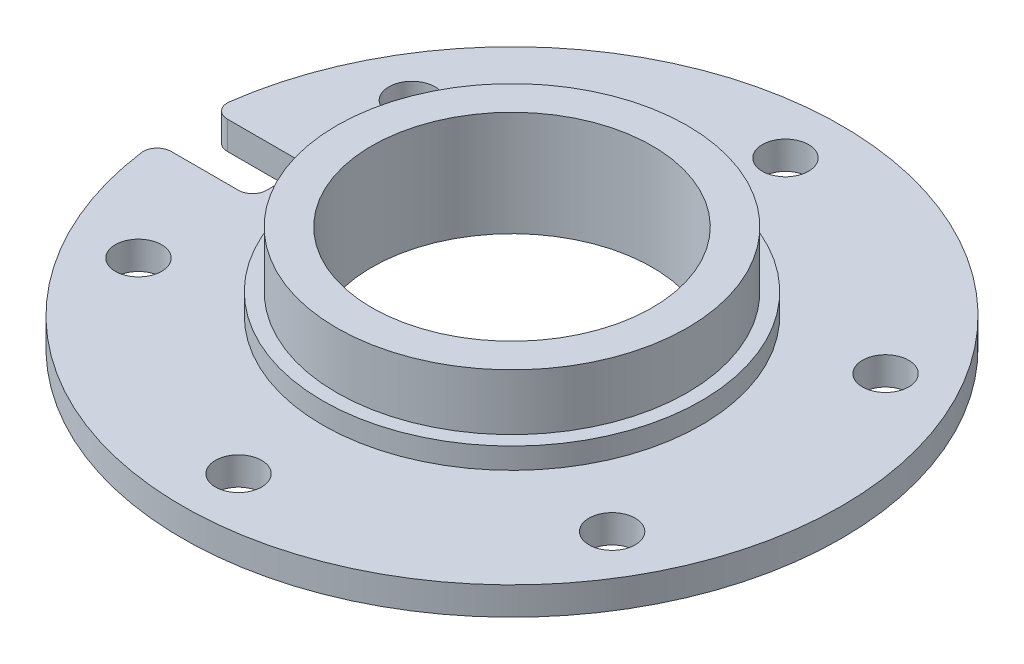
ISO-10303-21;
HEADER;
FILE_DESCRIPTION(('STEP AP214'),'2;1');
FILE_NAME('part.step','',(''),(''),'','','');
FILE_SCHEMA(('AUTOMOTIVE_DESIGN { 1 0 10303 214 1 1 1 1 }'));
ENDSEC;
DATA;
#1=APPLICATION_CONTEXT('core data for automotive mechanical design processes');
#2=APPLICATION_PROTOCOL_DEFINITION('international standard','automotive_design',2000,#1);
#3=PRODUCT_CONTEXT('',#1,'mechanical');
#4=PRODUCT('Part','Part','',(#3));
#5=PRODUCT_RELATED_PRODUCT_CATEGORY('part','',(#4));
#6=PRODUCT_DEFINITION_FORMATION('','',#4);
#7=PRODUCT_DEFINITION_CONTEXT('part definition',#1,'design');
#8=PRODUCT_DEFINITION('design','',#6,#7);
#9=PRODUCT_DEFINITION_SHAPE('','',#8);
#10=(LENGTH_UNIT() NAMED_UNIT(*) SI_UNIT(.MILLI.,.METRE.));
#11=(NAMED_UNIT(*) PLANE_ANGLE_UNIT() SI_UNIT($,.RADIAN.));
#12=(NAMED_UNIT(*) SI_UNIT($,.STERADIAN.) SOLID_ANGLE_UNIT());
#13=UNCERTAINTY_MEASURE_WITH_UNIT(LENGTH_MEASURE(1.E-05),#10,'distance_accuracy_value','');
#14=(GEOMETRIC_REPRESENTATION_CONTEXT(3) GLOBAL_UNCERTAINTY_ASSIGNED_CONTEXT((#13)) GLOBAL_UNIT_ASSIGNED_CONTEXT((#10,
#11,#12)) REPRESENTATION_CONTEXT('',''));
#15=CARTESIAN_POINT('',(0.,0.,0.));
#16=DIRECTION('',(0.,0.,1.));
#17=DIRECTION('',(1.,0.,0.));
#18=AXIS2_PLACEMENT_3D('',#15,#16,#17);
#19=CARTESIAN_POINT('',(0.,0.,0.));
#20=DIRECTION('',(0.,1.,0.));
#21=DIRECTION('',(0.,0.,1.));
#22=AXIS2_PLACEMENT_3D('',#19,#20,#21);
#23=PLANE('',#22);
#24=CARTESIAN_POINT('',(0.,0.,-19.5));
#25=DIRECTION('',(0.,-1.,0.));
#26=DIRECTION('',(0.,0.,-1.));
#27=AXIS2_PLACEMENT_3D('',#24,#25,#26);
#28=CIRCLE('',#27,1.65);
#29=CARTESIAN_POINT('',(0.,0.,-21.15));
#30=VERTEX_POINT('',#29);
#31=EDGE_CURVE('E312',#30,#30,#28,.T.);
#32=ORIENTED_EDGE('',*,*,#31,.F.);
#33=EDGE_LOOP('',(#32));
#34=FACE_BOUND('',#33,.T.);
#35=CARTESIAN_POINT('',(16.8874953737966,0.,-9.75));
#36=DIRECTION('',(0.,-1.,0.));
#37=DIRECTION('',(0.,0.,-1.));
#38=AXIS2_PLACEMENT_3D('',#35,#36,#37);
#39=CIRCLE('',#38,1.65);
#40=CARTESIAN_POINT('',(16.8874953737966,0.,-11.4));
#41=VERTEX_POINT('',#40);
#42=EDGE_CURVE('E181',#41,#41,#39,.T.);
#43=ORIENTED_EDGE('',*,*,#42,.F.);
#44=EDGE_LOOP('',(#43));
#45=FACE_BOUND('',#44,.T.);
#46=CARTESIAN_POINT('',(16.8874953737966,0.,9.75));
#47=DIRECTION('',(0.,-1.,0.));
#48=DIRECTION('',(0.,0.,-1.));
#49=AXIS2_PLACEMENT_3D('',#46,#47,#48);
#50=CIRCLE('',#49,1.65);
#51=CARTESIAN_POINT('',(16.8874953737966,0.,8.1));
#52=VERTEX_POINT('',#51);
#53=EDGE_CURVE('E171',#52,#52,#50,.T.);
#54=ORIENTED_EDGE('',*,*,#53,.F.);
#55=EDGE_LOOP('',(#54));
#56=FACE_BOUND('',#55,.T.);
#57=CARTESIAN_POINT('',(0.,0.,19.5));
#58=DIRECTION('',(0.,-1.,0.));
#59=DIRECTION('',(0.,0.,-1.));
#60=AXIS2_PLACEMENT_3D('',#57,#58,#59);
#61=CIRCLE('',#60,1.65);
#62=CARTESIAN_POINT('',(0.,0.,17.85));
#63=VERTEX_POINT('',#62);
#64=EDGE_CURVE('E168',#63,#63,#61,.T.);
#65=ORIENTED_EDGE('',*,*,#64,.F.);
#66=EDGE_LOOP('',(#65));
#67=FACE_BOUND('',#66,.T.);
#68=CARTESIAN_POINT('',(-16.8874953737966,0.,9.75000000000001));
#69=DIRECTION('',(0.,-1.,0.));
#70=DIRECTION('',(0.,0.,-1.));
#71=AXIS2_PLACEMENT_3D('',#68,#69,#70);
#72=CIRCLE('',#71,1.65);
#73=CARTESIAN_POINT('',(-16.8874953737966,0.,8.10000000000001));
#74=VERTEX_POINT('',#73);
#75=EDGE_CURVE('E165',#74,#74,#72,.T.);
#76=ORIENTED_EDGE('',*,*,#75,.F.);
#77=EDGE_LOOP('',(#76));
#78=FACE_BOUND('',#77,.T.);
#79=CARTESIAN_POINT('',(0.,0.,0.));
#80=DIRECTION('',(0.,1.,0.));
#81=DIRECTION('',(0.,0.,1.));
#82=AXIS2_PLACEMENT_3D('',#79,#80,#81);
#83=CIRCLE('',#82,10.);
#84=CARTESIAN_POINT('',(0.,0.,10.));
#85=VERTEX_POINT('',#84);
#86=EDGE_CURVE('E221',#85,#85,#83,.T.);
#87=ORIENTED_EDGE('',*,*,#86,.T.);
#88=EDGE_LOOP('',(#87));
#89=FACE_BOUND('',#88,.T.);
#90=CARTESIAN_POINT('',(0.,0.,0.));
#91=DIRECTION('',(0.,1.,0.));
#92=DIRECTION('',(0.,0.,1.));
#93=AXIS2_PLACEMENT_3D('',#90,#91,#92);
#94=CIRCLE('',#93,23.5);
#95=CARTESIAN_POINT('',(-23.290174370799,0.,3.13333333333333));
#96=VERTEX_POINT('',#95);
#97=CARTESIAN_POINT('',(-23.290174370799,0.,-3.13333333333334));
#98=VERTEX_POINT('',#97);
#99=EDGE_CURVE('E132',#96,#98,#94,.T.);
#100=ORIENTED_EDGE('',*,*,#99,.F.);
#101=CARTESIAN_POINT('',(-22.2991031209778,0.,3.));
#102=DIRECTION('',(0.,1.,0.));
#103=DIRECTION('',(0.,0.,1.));
#104=AXIS2_PLACEMENT_3D('',#101,#102,#103);
#105=CIRCLE('',#104,1.);
#106=CARTESIAN_POINT('',(-22.2991031209778,0.,2.));
#107=VERTEX_POINT('',#106);
#108=EDGE_CURVE('E135',#96,#107,#105,.F.);
#109=ORIENTED_EDGE('',*,*,#108,.T.);
#110=DIRECTION('',(-1.,0.,0.));
#111=VECTOR('',#110,1.);
#112=CARTESIAN_POINT('',(-24.2569867476914,0.,2.));
#113=LINE('',#112,#111);
#114=CARTESIAN_POINT('',(-17.5,0.,2.));
#115=VERTEX_POINT('',#114);
#116=EDGE_CURVE('E197',#115,#107,#113,.T.);
#117=ORIENTED_EDGE('',*,*,#116,.F.);
#118=CARTESIAN_POINT('',(-17.5,0.,0.999999999999997));
#119=DIRECTION('',(0.,1.,0.));
#120=DIRECTION('',(0.,0.,1.));
#121=AXIS2_PLACEMENT_3D('',#118,#119,#120);
#122=CIRCLE('',#121,1.);
#123=CARTESIAN_POINT('',(-16.5,0.,0.999999999999997));
#124=VERTEX_POINT('',#123);
#125=EDGE_CURVE('E156',#115,#124,#122,.T.);
#126=ORIENTED_EDGE('',*,*,#125,.T.);
#127=DIRECTION('',(0.,0.,1.));
#128=VECTOR('',#127,1.);
#129=CARTESIAN_POINT('',(-16.5,0.,2.));
#130=LINE('',#129,#128);
#131=CARTESIAN_POINT('',(-16.5,0.,-1.));
#132=VERTEX_POINT('',#131);
#133=EDGE_CURVE('E195',#132,#124,#130,.T.);
#134=ORIENTED_EDGE('',*,*,#133,.F.);
#135=CARTESIAN_POINT('',(-17.5,0.,-1.));
#136=DIRECTION('',(0.,1.,0.));
#137=DIRECTION('',(0.,0.,1.));
#138=AXIS2_PLACEMENT_3D('',#135,#136,#137);
#139=CIRCLE('',#138,1.);
#140=CARTESIAN_POINT('',(-17.5,0.,-2.));
#141=VERTEX_POINT('',#140);
#142=EDGE_CURVE('E52',#132,#141,#139,.T.);
#143=ORIENTED_EDGE('',*,*,#142,.T.);
#144=DIRECTION('',(1.,0.,0.));
#145=VECTOR('',#144,1.);
#146=CARTESIAN_POINT('',(-24.2569867476914,0.,-2.));
#147=LINE('',#146,#145);
#148=CARTESIAN_POINT('',(-22.2991031209778,0.,-2.));
#149=VERTEX_POINT('',#148);
#150=EDGE_CURVE('E192',#149,#141,#147,.T.);
#151=ORIENTED_EDGE('',*,*,#150,.F.);
#152=CARTESIAN_POINT('',(-22.2991031209778,0.,-3.));
#153=DIRECTION('',(0.,1.,0.));
#154=DIRECTION('',(0.,0.,1.));
#155=AXIS2_PLACEMENT_3D('',#152,#153,#154);
#156=CIRCLE('',#155,1.);
#157=EDGE_CURVE('E136',#149,#98,#156,.F.);
#158=ORIENTED_EDGE('',*,*,#157,.T.);
#159=EDGE_LOOP('',(#100,#109,#117,#126,#134,#143,#151,#158));
#160=FACE_BOUND('',#159,.T.);
#161=CARTESIAN_POINT('',(-16.8874953737966,0.,-9.75));
#162=DIRECTION('',(0.,-1.,0.));
#163=DIRECTION('',(0.,0.,-1.));
#164=AXIS2_PLACEMENT_3D('',#161,#162,#163);
#165=CIRCLE('',#164,1.65);
#166=CARTESIAN_POINT('',(-16.8874953737966,0.,-11.4));
#167=VERTEX_POINT('',#166);
#168=EDGE_CURVE('E164',#167,#167,#165,.T.);
#169=ORIENTED_EDGE('',*,*,#168,.F.);
#170=EDGE_LOOP('',(#169));
#171=FACE_BOUND('',#170,.T.);
#172=ADVANCED_FACE('F43',(#34,#45,#56,#67,#78,#89,#160,#171),#23,.F.);
#173=CARTESIAN_POINT('',(0.,2.,0.));
#174=DIRECTION('',(0.,1.,0.));
#175=DIRECTION('',(0.,0.,1.));
#176=AXIS2_PLACEMENT_3D('',#173,#174,#175);
#177=PLANE('',#176);
#178=CARTESIAN_POINT('',(0.,2.,-19.5));
#179=DIRECTION('',(0.,1.,0.));
#180=DIRECTION('',(0.,0.,1.));
#181=AXIS2_PLACEMENT_3D('',#178,#179,#180);
#182=CIRCLE('',#181,1.65);
#183=CARTESIAN_POINT('',(0.,2.,-17.85));
#184=VERTEX_POINT('',#183);
#185=EDGE_CURVE('E310',#184,#184,#182,.T.);
#186=ORIENTED_EDGE('',*,*,#185,.F.);
#187=EDGE_LOOP('',(#186));
#188=FACE_BOUND('',#187,.T.);
#189=CARTESIAN_POINT('',(16.8874953737966,2.,-9.75));
#190=DIRECTION('',(0.,1.,0.));
#191=DIRECTION('',(0.,0.,1.));
#192=AXIS2_PLACEMENT_3D('',#189,#190,#191);
#193=CIRCLE('',#192,1.65);
#194=CARTESIAN_POINT('',(16.8874953737966,2.,-8.1));
#195=VERTEX_POINT('',#194);
#196=EDGE_CURVE('E47',#195,#195,#193,.T.);
#197=ORIENTED_EDGE('',*,*,#196,.F.);
#198=EDGE_LOOP('',(#197));
#199=FACE_BOUND('',#198,.T.);
#200=CARTESIAN_POINT('',(16.8874953737966,2.,9.75));
#201=DIRECTION('',(0.,1.,0.));
#202=DIRECTION('',(0.,0.,1.));
#203=AXIS2_PLACEMENT_3D('',#200,#201,#202);
#204=CIRCLE('',#203,1.65);
#205=CARTESIAN_POINT('',(16.8874953737966,2.,11.4));
#206=VERTEX_POINT('',#205);
#207=EDGE_CURVE('E169',#206,#206,#204,.T.);
#208=ORIENTED_EDGE('',*,*,#207,.F.);
#209=EDGE_LOOP('',(#208));
#210=FACE_BOUND('',#209,.T.);
#211=CARTESIAN_POINT('',(0.,2.,19.5));
#212=DIRECTION('',(0.,1.,0.));
#213=DIRECTION('',(0.,0.,1.));
#214=AXIS2_PLACEMENT_3D('',#211,#212,#213);
#215=CIRCLE('',#214,1.65);
#216=CARTESIAN_POINT('',(0.,2.,21.15));
#217=VERTEX_POINT('',#216);
#218=EDGE_CURVE('E166',#217,#217,#215,.T.);
#219=ORIENTED_EDGE('',*,*,#218,.F.);
#220=EDGE_LOOP('',(#219));
#221=FACE_BOUND('',#220,.T.);
#222=CARTESIAN_POINT('',(-16.8874953737966,2.,9.75000000000001));
#223=DIRECTION('',(0.,1.,0.));
#224=DIRECTION('',(0.,0.,1.));
#225=AXIS2_PLACEMENT_3D('',#222,#223,#224);
#226=CIRCLE('',#225,1.65);
#227=CARTESIAN_POINT('',(-16.8874953737966,2.,11.4));
#228=VERTEX_POINT('',#227);
#229=EDGE_CURVE('E161',#228,#228,#226,.T.);
#230=ORIENTED_EDGE('',*,*,#229,.F.);
#231=EDGE_LOOP('',(#230));
#232=FACE_BOUND('',#231,.T.);
#233=CARTESIAN_POINT('',(-16.8874953737966,2.,-9.75));
#234=DIRECTION('',(0.,1.,0.));
#235=DIRECTION('',(0.,0.,1.));
#236=AXIS2_PLACEMENT_3D('',#233,#234,#235);
#237=CIRCLE('',#236,1.65);
#238=CARTESIAN_POINT('',(-16.8874953737966,2.,-8.1));
#239=VERTEX_POINT('',#238);
#240=EDGE_CURVE('E189',#239,#239,#237,.T.);
#241=ORIENTED_EDGE('',*,*,#240,.F.);
#242=EDGE_LOOP('',(#241));
#243=FACE_BOUND('',#242,.T.);
#244=DIRECTION('',(1.,0.,0.));
#245=VECTOR('',#244,1.);
#246=CARTESIAN_POINT('',(0.,2.,2.));
#247=LINE('',#246,#245);
#248=CARTESIAN_POINT('',(-22.2991031209778,2.,2.));
#249=VERTEX_POINT('',#248);
#250=CARTESIAN_POINT('',(-17.5,2.,2.));
#251=VERTEX_POINT('',#250);
#252=EDGE_CURVE('E116',#249,#251,#247,.T.);
#253=ORIENTED_EDGE('',*,*,#252,.F.);
#254=CARTESIAN_POINT('',(-22.2991031209778,2.,3.));
#255=DIRECTION('',(0.,1.,0.));
#256=DIRECTION('',(0.,0.,1.));
#257=AXIS2_PLACEMENT_3D('',#254,#255,#256);
#258=CIRCLE('',#257,1.);
#259=CARTESIAN_POINT('',(-23.290174370799,2.,3.13333333333333));
#260=VERTEX_POINT('',#259);
#261=EDGE_CURVE('E110',#249,#260,#258,.T.);
#262=ORIENTED_EDGE('',*,*,#261,.T.);
#263=CARTESIAN_POINT('',(0.,2.,0.));
#264=DIRECTION('',(0.,1.,0.));
#265=DIRECTION('',(0.,0.,1.));
#266=AXIS2_PLACEMENT_3D('',#263,#264,#265);
#267=CIRCLE('',#266,23.5);
#268=CARTESIAN_POINT('',(-23.290174370799,2.,-3.13333333333334));
#269=VERTEX_POINT('',#268);
#270=EDGE_CURVE('E114',#260,#269,#267,.T.);
#271=ORIENTED_EDGE('',*,*,#270,.T.);
#272=CARTESIAN_POINT('',(-22.2991031209778,2.,-3.));
#273=DIRECTION('',(0.,1.,0.));
#274=DIRECTION('',(0.,0.,1.));
#275=AXIS2_PLACEMENT_3D('',#272,#273,#274);
#276=CIRCLE('',#275,1.);
#277=CARTESIAN_POINT('',(-22.2991031209778,2.,-2.));
#278=VERTEX_POINT('',#277);
#279=EDGE_CURVE('E121',#269,#278,#276,.T.);
#280=ORIENTED_EDGE('',*,*,#279,.T.);
#281=DIRECTION('',(-1.,0.,0.));
#282=VECTOR('',#281,1.);
#283=CARTESIAN_POINT('',(0.,2.,-2.));
#284=LINE('',#283,#282);
#285=CARTESIAN_POINT('',(-17.5,2.,-2.));
#286=VERTEX_POINT('',#285);
#287=EDGE_CURVE('E200',#286,#278,#284,.T.);
#288=ORIENTED_EDGE('',*,*,#287,.F.);
#289=CARTESIAN_POINT('',(-17.5,2.,-1.));
#290=DIRECTION('',(0.,1.,0.));
#291=DIRECTION('',(0.,0.,1.));
#292=AXIS2_PLACEMENT_3D('',#289,#290,#291);
#293=CIRCLE('',#292,1.);
#294=CARTESIAN_POINT('',(-16.5,2.,-1.));
#295=VERTEX_POINT('',#294);
#296=EDGE_CURVE('E11',#286,#295,#293,.F.);
#297=ORIENTED_EDGE('',*,*,#296,.T.);
#298=DIRECTION('',(0.,0.,-1.));
#299=VECTOR('',#298,1.);
#300=CARTESIAN_POINT('',(-16.5,2.,0.));
#301=LINE('',#300,#299);
#302=CARTESIAN_POINT('',(-16.5,2.,0.999999999999997));
#303=VERTEX_POINT('',#302);
#304=EDGE_CURVE('E204',#303,#295,#301,.T.);
#305=ORIENTED_EDGE('',*,*,#304,.F.);
#306=CARTESIAN_POINT('',(-17.5,2.,0.999999999999997));
#307=DIRECTION('',(0.,1.,0.));
#308=DIRECTION('',(0.,0.,1.));
#309=AXIS2_PLACEMENT_3D('',#306,#307,#308);
#310=CIRCLE('',#309,1.);
#311=EDGE_CURVE('E158',#303,#251,#310,.F.);
#312=ORIENTED_EDGE('',*,*,#311,.T.);
#313=EDGE_LOOP('',(#253,#262,#271,#280,#288,#297,#305,#312));
#314=FACE_BOUND('',#313,.T.);
#315=CARTESIAN_POINT('',(0.,2.,0.));
#316=DIRECTION('',(0.,1.,0.));
#317=DIRECTION('',(0.,0.,1.));
#318=AXIS2_PLACEMENT_3D('',#315,#316,#317);
#319=CIRCLE('',#318,13.5);
#320=CARTESIAN_POINT('',(0.,2.,13.5));
#321=VERTEX_POINT('',#320);
#322=EDGE_CURVE('E209',#321,#321,#319,.T.);
#323=ORIENTED_EDGE('',*,*,#322,.F.);
#324=EDGE_LOOP('',(#323));
#325=FACE_BOUND('',#324,.T.);
#326=ADVANCED_FACE('F112',(#188,#199,#210,#221,#232,#243,#314,#325),#177,.T.);
#327=CARTESIAN_POINT('',(0.,2.,0.));
#328=DIRECTION('',(0.,-1.,0.));
#329=DIRECTION('',(0.,0.,-1.));
#330=AXIS2_PLACEMENT_3D('',#327,#328,#329);
#331=CYLINDRICAL_SURFACE('',#330,23.5);
#332=ORIENTED_EDGE('',*,*,#270,.F.);
#333=DIRECTION('',(0.,-1.,0.));
#334=VECTOR('',#333,1.);
#335=CARTESIAN_POINT('',(-23.290174370799,2.,3.13333333333333));
#336=LINE('',#335,#334);
#337=EDGE_CURVE('E128',#260,#96,#336,.T.);
#338=ORIENTED_EDGE('',*,*,#337,.T.);
#339=ORIENTED_EDGE('',*,*,#99,.T.);
#340=DIRECTION('',(0.,-1.,0.));
#341=VECTOR('',#340,1.);
#342=CARTESIAN_POINT('',(-23.290174370799,2.,-3.13333333333334));
#343=LINE('',#342,#341);
#344=EDGE_CURVE('E131',#98,#269,#343,.F.);
#345=ORIENTED_EDGE('',*,*,#344,.T.);
#346=EDGE_LOOP('',(#332,#338,#339,#345));
#347=FACE_BOUND('',#346,.T.);
#348=ADVANCED_FACE('F126',(#347),#331,.T.);
#349=CARTESIAN_POINT('',(0.,2.,0.));
#350=DIRECTION('',(0.,-1.,0.));
#351=DIRECTION('',(0.,0.,-1.));
#352=AXIS2_PLACEMENT_3D('',#349,#350,#351);
#353=CYLINDRICAL_SURFACE('',#352,10.);
#354=ORIENTED_EDGE('',*,*,#86,.F.);
#355=EDGE_LOOP('',(#354));
#356=FACE_BOUND('',#355,.T.);
#357=CARTESIAN_POINT('',(0.,7.5,0.));
#358=DIRECTION('',(0.,1.,0.));
#359=DIRECTION('',(0.,0.,1.));
#360=AXIS2_PLACEMENT_3D('',#357,#358,#359);
#361=CIRCLE('',#360,10.);
#362=CARTESIAN_POINT('',(0.,7.5,10.));
#363=VERTEX_POINT('',#362);
#364=EDGE_CURVE('E213',#363,#363,#361,.T.);
#365=ORIENTED_EDGE('',*,*,#364,.T.);
#366=EDGE_LOOP('',(#365));
#367=FACE_BOUND('',#366,.T.);
#368=ADVANCED_FACE('F271',(#356,#367),#353,.F.);
#369=CARTESIAN_POINT('',(0.,7.5,0.));
#370=DIRECTION('',(0.,1.,0.));
#371=DIRECTION('',(0.,0.,1.));
#372=AXIS2_PLACEMENT_3D('',#369,#370,#371);
#373=PLANE('',#372);
#374=CARTESIAN_POINT('',(0.,7.5,0.));
#375=DIRECTION('',(0.,1.,0.));
#376=DIRECTION('',(0.,0.,1.));
#377=AXIS2_PLACEMENT_3D('',#374,#375,#376);
#378=CIRCLE('',#377,12.5);
#379=CARTESIAN_POINT('',(0.,7.5,12.5));
#380=VERTEX_POINT('',#379);
#381=EDGE_CURVE('E218',#380,#380,#378,.T.);
#382=ORIENTED_EDGE('',*,*,#381,.T.);
#383=EDGE_LOOP('',(#382));
#384=FACE_BOUND('',#383,.T.);
#385=ORIENTED_EDGE('',*,*,#364,.F.);
#386=EDGE_LOOP('',(#385));
#387=FACE_BOUND('',#386,.T.);
#388=ADVANCED_FACE('F327',(#384,#387),#373,.T.);
#389=CARTESIAN_POINT('',(0.,7.5,0.));
#390=DIRECTION('',(0.,-1.,0.));
#391=DIRECTION('',(0.,0.,-1.));
#392=AXIS2_PLACEMENT_3D('',#389,#390,#391);
#393=CYLINDRICAL_SURFACE('',#392,12.5);
#394=CARTESIAN_POINT('',(0.,3.5,0.));
#395=DIRECTION('',(0.,1.,0.));
#396=DIRECTION('',(0.,0.,1.));
#397=AXIS2_PLACEMENT_3D('',#394,#395,#396);
#398=CIRCLE('',#397,12.5);
#399=CARTESIAN_POINT('',(0.,3.5,12.5));
#400=VERTEX_POINT('',#399);
#401=EDGE_CURVE('E206',#400,#400,#398,.T.);
#402=ORIENTED_EDGE('',*,*,#401,.T.);
#403=EDGE_LOOP('',(#402));
#404=FACE_BOUND('',#403,.T.);
#405=ORIENTED_EDGE('',*,*,#381,.F.);
#406=EDGE_LOOP('',(#405));
#407=FACE_BOUND('',#406,.T.);
#408=ADVANCED_FACE('F331',(#404,#407),#393,.T.);
#409=CARTESIAN_POINT('',(0.,3.5,0.));
#410=DIRECTION('',(0.,1.,0.));
#411=DIRECTION('',(0.,0.,1.));
#412=AXIS2_PLACEMENT_3D('',#409,#410,#411);
#413=PLANE('',#412);
#414=CARTESIAN_POINT('',(0.,3.5,0.));
#415=DIRECTION('',(0.,1.,0.));
#416=DIRECTION('',(0.,0.,1.));
#417=AXIS2_PLACEMENT_3D('',#414,#415,#416);
#418=CIRCLE('',#417,13.5);
#419=CARTESIAN_POINT('',(0.,3.5,13.5));
#420=VERTEX_POINT('',#419);
#421=EDGE_CURVE('E210',#420,#420,#418,.T.);
#422=ORIENTED_EDGE('',*,*,#421,.T.);
#423=EDGE_LOOP('',(#422));
#424=FACE_BOUND('',#423,.T.);
#425=ORIENTED_EDGE('',*,*,#401,.F.);
#426=EDGE_LOOP('',(#425));
#427=FACE_BOUND('',#426,.T.);
#428=ADVANCED_FACE('F253',(#424,#427),#413,.T.);
#429=CARTESIAN_POINT('',(0.,3.5,0.));
#430=DIRECTION('',(0.,-1.,0.));
#431=DIRECTION('',(0.,0.,-1.));
#432=AXIS2_PLACEMENT_3D('',#429,#430,#431);
#433=CYLINDRICAL_SURFACE('',#432,13.5);
#434=ORIENTED_EDGE('',*,*,#421,.F.);
#435=EDGE_LOOP('',(#434));
#436=FACE_BOUND('',#435,.T.);
#437=ORIENTED_EDGE('',*,*,#322,.T.);
#438=EDGE_LOOP('',(#437));
#439=FACE_BOUND('',#438,.T.);
#440=ADVANCED_FACE('F245',(#436,#439),#433,.T.);
#441=CARTESIAN_POINT('',(-24.2569867476914,10.,2.));
#442=DIRECTION('',(0.,0.,1.));
#443=DIRECTION('',(1.,0.,0.));
#444=AXIS2_PLACEMENT_3D('',#441,#442,#443);
#445=PLANE('',#444);
#446=ORIENTED_EDGE('',*,*,#116,.T.);
#447=DIRECTION('',(0.,-1.,0.));
#448=VECTOR('',#447,1.);
#449=CARTESIAN_POINT('',(-22.2991031209778,10.,2.));
#450=LINE('',#449,#448);
#451=EDGE_CURVE('E146',#107,#249,#450,.F.);
#452=ORIENTED_EDGE('',*,*,#451,.T.);
#453=ORIENTED_EDGE('',*,*,#252,.T.);
#454=DIRECTION('',(0.,-1.,0.));
#455=VECTOR('',#454,1.);
#456=CARTESIAN_POINT('',(-17.5,0.,2.));
#457=LINE('',#456,#455);
#458=EDGE_CURVE('E143',#251,#115,#457,.T.);
#459=ORIENTED_EDGE('',*,*,#458,.T.);
#460=EDGE_LOOP('',(#446,#452,#453,#459));
#461=FACE_BOUND('',#460,.T.);
#462=ADVANCED_FACE('F243',(#461),#445,.F.);
#463=CARTESIAN_POINT('',(-16.5,10.,2.));
#464=DIRECTION('',(1.,0.,0.));
#465=DIRECTION('',(0.,0.,-1.));
#466=AXIS2_PLACEMENT_3D('',#463,#464,#465);
#467=PLANE('',#466);
#468=ORIENTED_EDGE('',*,*,#133,.T.);
#469=DIRECTION('',(0.,-1.,0.));
#470=VECTOR('',#469,1.);
#471=CARTESIAN_POINT('',(-16.5,2.,0.999999999999997));
#472=LINE('',#471,#470);
#473=EDGE_CURVE('E65',#124,#303,#472,.F.);
#474=ORIENTED_EDGE('',*,*,#473,.T.);
#475=ORIENTED_EDGE('',*,*,#304,.T.);
#476=DIRECTION('',(0.,-1.,0.));
#477=VECTOR('',#476,1.);
#478=CARTESIAN_POINT('',(-16.5,0.,-1.));
#479=LINE('',#478,#477);
#480=EDGE_CURVE('E152',#295,#132,#479,.T.);
#481=ORIENTED_EDGE('',*,*,#480,.T.);
#482=EDGE_LOOP('',(#468,#474,#475,#481));
#483=FACE_BOUND('',#482,.T.);
#484=ADVANCED_FACE('F235',(#483),#467,.F.);
#485=CARTESIAN_POINT('',(-24.2569867476914,10.,-2.));
#486=DIRECTION('',(0.,0.,-1.));
#487=DIRECTION('',(-1.,0.,0.));
#488=AXIS2_PLACEMENT_3D('',#485,#486,#487);
#489=PLANE('',#488);
#490=ORIENTED_EDGE('',*,*,#287,.T.);
#491=DIRECTION('',(0.,-1.,0.));
#492=VECTOR('',#491,1.);
#493=CARTESIAN_POINT('',(-22.2991031209778,10.,-2.));
#494=LINE('',#493,#492);
#495=EDGE_CURVE('E150',#278,#149,#494,.T.);
#496=ORIENTED_EDGE('',*,*,#495,.T.);
#497=ORIENTED_EDGE('',*,*,#150,.T.);
#498=DIRECTION('',(0.,-1.,0.));
#499=VECTOR('',#498,1.);
#500=CARTESIAN_POINT('',(-17.5,2.,-2.));
#501=LINE('',#500,#499);
#502=EDGE_CURVE('E120',#141,#286,#501,.F.);
#503=ORIENTED_EDGE('',*,*,#502,.T.);
#504=EDGE_LOOP('',(#490,#496,#497,#503));
#505=FACE_BOUND('',#504,.T.);
#506=ADVANCED_FACE('F229',(#505),#489,.F.);
#507=CARTESIAN_POINT('',(-22.2991031209778,2.,3.));
#508=DIRECTION('',(0.,-1.,0.));
#509=DIRECTION('',(0.,0.,-1.));
#510=AXIS2_PLACEMENT_3D('',#507,#508,#509);
#511=CYLINDRICAL_SURFACE('',#510,1.);
#512=ORIENTED_EDGE('',*,*,#261,.F.);
#513=ORIENTED_EDGE('',*,*,#451,.F.);
#514=ORIENTED_EDGE('',*,*,#108,.F.);
#515=ORIENTED_EDGE('',*,*,#337,.F.);
#516=EDGE_LOOP('',(#512,#513,#514,#515));
#517=FACE_BOUND('',#516,.T.);
#518=ADVANCED_FACE('F134',(#517),#511,.T.);
#519=CARTESIAN_POINT('',(-22.2991031209778,2.,-3.));
#520=DIRECTION('',(0.,-1.,0.));
#521=DIRECTION('',(0.,0.,-1.));
#522=AXIS2_PLACEMENT_3D('',#519,#520,#521);
#523=CYLINDRICAL_SURFACE('',#522,1.);
#524=ORIENTED_EDGE('',*,*,#157,.F.);
#525=ORIENTED_EDGE('',*,*,#495,.F.);
#526=ORIENTED_EDGE('',*,*,#279,.F.);
#527=ORIENTED_EDGE('',*,*,#344,.F.);
#528=EDGE_LOOP('',(#524,#525,#526,#527));
#529=FACE_BOUND('',#528,.T.);
#530=ADVANCED_FACE('F226',(#529),#523,.T.);
#531=CARTESIAN_POINT('',(-17.5,10.,0.999999999999997));
#532=DIRECTION('',(0.,1.,0.));
#533=DIRECTION('',(0.,0.,1.));
#534=AXIS2_PLACEMENT_3D('',#531,#532,#533);
#535=CYLINDRICAL_SURFACE('',#534,1.);
#536=ORIENTED_EDGE('',*,*,#311,.F.);
#537=ORIENTED_EDGE('',*,*,#473,.F.);
#538=ORIENTED_EDGE('',*,*,#125,.F.);
#539=ORIENTED_EDGE('',*,*,#458,.F.);
#540=EDGE_LOOP('',(#536,#537,#538,#539));
#541=FACE_BOUND('',#540,.T.);
#542=ADVANCED_FACE('F241',(#541),#535,.F.);
#543=CARTESIAN_POINT('',(-17.5,10.,-1.));
#544=DIRECTION('',(0.,1.,0.));
#545=DIRECTION('',(0.,0.,1.));
#546=AXIS2_PLACEMENT_3D('',#543,#544,#545);
#547=CYLINDRICAL_SURFACE('',#546,1.);
#548=ORIENTED_EDGE('',*,*,#296,.F.);
#549=ORIENTED_EDGE('',*,*,#502,.F.);
#550=ORIENTED_EDGE('',*,*,#142,.F.);
#551=ORIENTED_EDGE('',*,*,#480,.F.);
#552=EDGE_LOOP('',(#548,#549,#550,#551));
#553=FACE_BOUND('',#552,.T.);
#554=ADVANCED_FACE('F45',(#553),#547,.F.);
#555=CARTESIAN_POINT('',(-16.8874953737966,0.,-9.75));
#556=DIRECTION('',(0.,-1.,0.));
#557=DIRECTION('',(0.,0.,-1.));
#558=AXIS2_PLACEMENT_3D('',#555,#556,#557);
#559=CYLINDRICAL_SURFACE('',#558,1.65);
#560=ORIENTED_EDGE('',*,*,#240,.T.);
#561=EDGE_LOOP('',(#560));
#562=FACE_BOUND('',#561,.T.);
#563=ORIENTED_EDGE('',*,*,#168,.T.);
#564=EDGE_LOOP('',(#563));
#565=FACE_BOUND('',#564,.T.);
#566=ADVANCED_FACE('F278',(#562,#565),#559,.F.);
#567=CARTESIAN_POINT('',(-16.8874953737966,0.,9.75000000000001));
#568=DIRECTION('',(0.,-1.,0.));
#569=DIRECTION('',(0.,0.,-1.));
#570=AXIS2_PLACEMENT_3D('',#567,#568,#569);
#571=CYLINDRICAL_SURFACE('',#570,1.65);
#572=ORIENTED_EDGE('',*,*,#229,.T.);
#573=EDGE_LOOP('',(#572));
#574=FACE_BOUND('',#573,.T.);
#575=ORIENTED_EDGE('',*,*,#75,.T.);
#576=EDGE_LOOP('',(#575));
#577=FACE_BOUND('',#576,.T.);
#578=ADVANCED_FACE('F282',(#574,#577),#571,.F.);
#579=CARTESIAN_POINT('',(0.,0.,19.5));
#580=DIRECTION('',(0.,-1.,0.));
#581=DIRECTION('',(0.,0.,-1.));
#582=AXIS2_PLACEMENT_3D('',#579,#580,#581);
#583=CYLINDRICAL_SURFACE('',#582,1.65);
#584=ORIENTED_EDGE('',*,*,#218,.T.);
#585=EDGE_LOOP('',(#584));
#586=FACE_BOUND('',#585,.T.);
#587=ORIENTED_EDGE('',*,*,#64,.T.);
#588=EDGE_LOOP('',(#587));
#589=FACE_BOUND('',#588,.T.);
#590=ADVANCED_FACE('F287',(#586,#589),#583,.F.);
#591=CARTESIAN_POINT('',(16.8874953737966,0.,9.75));
#592=DIRECTION('',(0.,-1.,0.));
#593=DIRECTION('',(0.,0.,-1.));
#594=AXIS2_PLACEMENT_3D('',#591,#592,#593);
#595=CYLINDRICAL_SURFACE('',#594,1.65);
#596=ORIENTED_EDGE('',*,*,#207,.T.);
#597=EDGE_LOOP('',(#596));
#598=FACE_BOUND('',#597,.T.);
#599=ORIENTED_EDGE('',*,*,#53,.T.);
#600=EDGE_LOOP('',(#599));
#601=FACE_BOUND('',#600,.T.);
#602=ADVANCED_FACE('F294',(#598,#601),#595,.F.);
#603=CARTESIAN_POINT('',(16.8874953737966,0.,-9.75));
#604=DIRECTION('',(0.,-1.,0.));
#605=DIRECTION('',(0.,0.,-1.));
#606=AXIS2_PLACEMENT_3D('',#603,#604,#605);
#607=CYLINDRICAL_SURFACE('',#606,1.65);
#608=ORIENTED_EDGE('',*,*,#196,.T.);
#609=EDGE_LOOP('',(#608));
#610=FACE_BOUND('',#609,.T.);
#611=ORIENTED_EDGE('',*,*,#42,.T.);
#612=EDGE_LOOP('',(#611));
#613=FACE_BOUND('',#612,.T.);
#614=ADVANCED_FACE('F298',(#610,#613),#607,.F.);
#615=CARTESIAN_POINT('',(0.,0.,-19.5));
#616=DIRECTION('',(0.,-1.,0.));
#617=DIRECTION('',(0.,0.,-1.));
#618=AXIS2_PLACEMENT_3D('',#615,#616,#617);
#619=CYLINDRICAL_SURFACE('',#618,1.65);
#620=ORIENTED_EDGE('',*,*,#185,.T.);
#621=EDGE_LOOP('',(#620));
#622=FACE_BOUND('',#621,.T.);
#623=ORIENTED_EDGE('',*,*,#31,.T.);
#624=EDGE_LOOP('',(#623));
#625=FACE_BOUND('',#624,.T.);
#626=ADVANCED_FACE('F301',(#622,#625),#619,.F.);
#627=CLOSED_SHELL('',(#172,#326,#348,#368,#388,#408,#428,#440,#462,#484,#506,#518,#530,#542,
#554,#566,#578,#590,#602,#614,#626));
#628=MANIFOLD_SOLID_BREP('B2',#627);
#629=ADVANCED_BREP_SHAPE_REPRESENTATION('',(#18,#628),#14);
#630=SHAPE_DEFINITION_REPRESENTATION(#9,#629);
ENDSEC;
END-ISO-10303-21;
